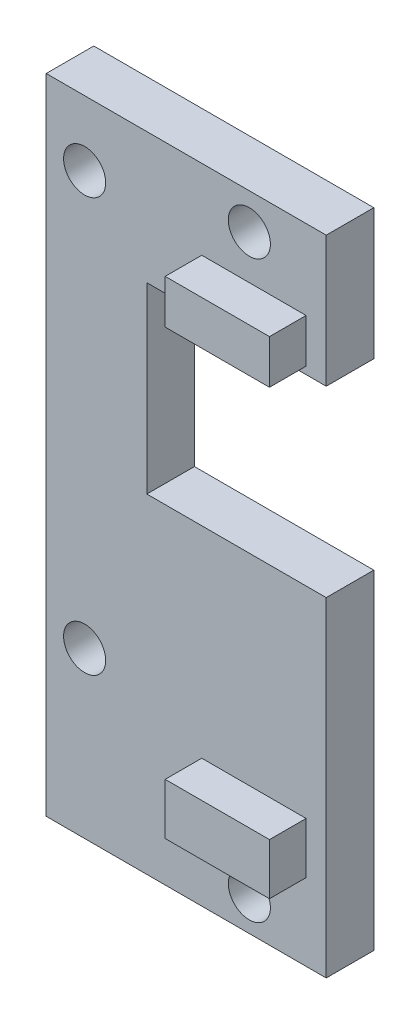
ISO-10303-21;
HEADER;
FILE_DESCRIPTION(('STEP AP214'),'2;1');
FILE_NAME('part.step','',(''),(''),'','','');
FILE_SCHEMA(('AUTOMOTIVE_DESIGN { 1 0 10303 214 1 1 1 1 }'));
ENDSEC;
DATA;
#1=APPLICATION_CONTEXT('core data for automotive mechanical design processes');
#2=APPLICATION_PROTOCOL_DEFINITION('international standard','automotive_design',2000,#1);
#3=PRODUCT_CONTEXT('',#1,'mechanical');
#4=PRODUCT('Part','Part','',(#3));
#5=PRODUCT_RELATED_PRODUCT_CATEGORY('part','',(#4));
#6=PRODUCT_DEFINITION_FORMATION('','',#4);
#7=PRODUCT_DEFINITION_CONTEXT('part definition',#1,'design');
#8=PRODUCT_DEFINITION('design','',#6,#7);
#9=PRODUCT_DEFINITION_SHAPE('','',#8);
#10=(LENGTH_UNIT() NAMED_UNIT(*) SI_UNIT(.MILLI.,.METRE.));
#11=(NAMED_UNIT(*) PLANE_ANGLE_UNIT() SI_UNIT($,.RADIAN.));
#12=(NAMED_UNIT(*) SI_UNIT($,.STERADIAN.) SOLID_ANGLE_UNIT());
#13=UNCERTAINTY_MEASURE_WITH_UNIT(LENGTH_MEASURE(1.E-05),#10,'distance_accuracy_value','');
#14=(GEOMETRIC_REPRESENTATION_CONTEXT(3) GLOBAL_UNCERTAINTY_ASSIGNED_CONTEXT((#13)) GLOBAL_UNIT_ASSIGNED_CONTEXT((#10,
#11,#12)) REPRESENTATION_CONTEXT('',''));
#15=CARTESIAN_POINT('',(0.,0.,0.));
#16=DIRECTION('',(0.,0.,1.));
#17=DIRECTION('',(1.,0.,0.));
#18=AXIS2_PLACEMENT_3D('',#15,#16,#17);
#19=CARTESIAN_POINT('',(0.,0.,2.6));
#20=DIRECTION('',(0.,0.,1.));
#21=DIRECTION('',(1.,0.,0.));
#22=AXIS2_PLACEMENT_3D('',#19,#20,#21);
#23=PLANE('',#22);
#24=CARTESIAN_POINT('',(-29.4,-30.2,2.6));
#25=DIRECTION('',(0.,0.,1.));
#26=DIRECTION('',(1.,0.,0.));
#27=AXIS2_PLACEMENT_3D('',#24,#25,#26);
#28=CIRCLE('',#27,1.15);
#29=CARTESIAN_POINT('',(-28.25,-30.2,2.6));
#30=VERTEX_POINT('',#29);
#31=EDGE_CURVE('E222',#30,#30,#28,.T.);
#32=ORIENTED_EDGE('',*,*,#31,.F.);
#33=EDGE_LOOP('',(#32));
#34=FACE_BOUND('',#33,.T.);
#35=CARTESIAN_POINT('',(-38.4,-23.,2.6));
#36=DIRECTION('',(0.,0.,1.));
#37=DIRECTION('',(1.,0.,0.));
#38=AXIS2_PLACEMENT_3D('',#35,#36,#37);
#39=CIRCLE('',#38,1.15);
#40=CARTESIAN_POINT('',(-37.25,-23.,2.6));
#41=VERTEX_POINT('',#40);
#42=EDGE_CURVE('E234',#41,#41,#39,.T.);
#43=ORIENTED_EDGE('',*,*,#42,.F.);
#44=EDGE_LOOP('',(#43));
#45=FACE_BOUND('',#44,.T.);
#46=DIRECTION('',(0.,-1.,0.));
#47=VECTOR('',#46,1.);
#48=CARTESIAN_POINT('',(-40.5,3.15,2.6));
#49=LINE('',#48,#47);
#50=CARTESIAN_POINT('',(-40.5,3.15,2.6));
#51=VERTEX_POINT('',#50);
#52=CARTESIAN_POINT('',(-40.5,-32.,2.6));
#53=VERTEX_POINT('',#52);
#54=EDGE_CURVE('E240',#51,#53,#49,.T.);
#55=ORIENTED_EDGE('',*,*,#54,.T.);
#56=DIRECTION('',(1.,0.,0.));
#57=VECTOR('',#56,1.);
#58=CARTESIAN_POINT('',(-40.5,-32.,2.6));
#59=LINE('',#58,#57);
#60=CARTESIAN_POINT('',(-25.2,-32.,2.6));
#61=VERTEX_POINT('',#60);
#62=EDGE_CURVE('E243',#53,#61,#59,.T.);
#63=ORIENTED_EDGE('',*,*,#62,.T.);
#64=DIRECTION('',(0.,1.,0.));
#65=VECTOR('',#64,1.);
#66=CARTESIAN_POINT('',(-25.2,-32.,2.6));
#67=LINE('',#66,#65);
#68=CARTESIAN_POINT('',(-25.2,-14.,2.6));
#69=VERTEX_POINT('',#68);
#70=EDGE_CURVE('E246',#61,#69,#67,.T.);
#71=ORIENTED_EDGE('',*,*,#70,.T.);
#72=DIRECTION('',(-1.,0.,0.));
#73=VECTOR('',#72,1.);
#74=CARTESIAN_POINT('',(-25.2,-14.,2.6));
#75=LINE('',#74,#73);
#76=CARTESIAN_POINT('',(-35.,-14.,2.6));
#77=VERTEX_POINT('',#76);
#78=EDGE_CURVE('E248',#69,#77,#75,.T.);
#79=ORIENTED_EDGE('',*,*,#78,.T.);
#80=DIRECTION('',(0.,1.,0.));
#81=VECTOR('',#80,1.);
#82=CARTESIAN_POINT('',(-35.,-14.,2.6));
#83=LINE('',#82,#81);
#84=CARTESIAN_POINT('',(-35.,-4.,2.6));
#85=VERTEX_POINT('',#84);
#86=EDGE_CURVE('E250',#77,#85,#83,.T.);
#87=ORIENTED_EDGE('',*,*,#86,.T.);
#88=DIRECTION('',(1.,0.,0.));
#89=VECTOR('',#88,1.);
#90=CARTESIAN_POINT('',(-35.,-4.,2.6));
#91=LINE('',#90,#89);
#92=CARTESIAN_POINT('',(-25.2,-4.,2.6));
#93=VERTEX_POINT('',#92);
#94=EDGE_CURVE('E252',#85,#93,#91,.T.);
#95=ORIENTED_EDGE('',*,*,#94,.T.);
#96=DIRECTION('',(0.,1.,0.));
#97=VECTOR('',#96,1.);
#98=CARTESIAN_POINT('',(-25.2,-4.,2.6));
#99=LINE('',#98,#97);
#100=CARTESIAN_POINT('',(-25.2,3.15,2.6));
#101=VERTEX_POINT('',#100);
#102=EDGE_CURVE('E254',#93,#101,#99,.T.);
#103=ORIENTED_EDGE('',*,*,#102,.T.);
#104=DIRECTION('',(-1.,0.,0.));
#105=VECTOR('',#104,1.);
#106=CARTESIAN_POINT('',(-25.2,3.15,2.6));
#107=LINE('',#106,#105);
#108=EDGE_CURVE('E256',#101,#51,#107,.T.);
#109=ORIENTED_EDGE('',*,*,#108,.T.);
#110=EDGE_LOOP('',(#55,#63,#71,#79,#87,#95,#103,#109));
#111=FACE_BOUND('',#110,.T.);
#112=CARTESIAN_POINT('',(-38.4,-0.4,2.6));
#113=DIRECTION('',(0.,0.,1.));
#114=DIRECTION('',(1.,0.,0.));
#115=AXIS2_PLACEMENT_3D('',#112,#113,#114);
#116=CIRCLE('',#115,1.15);
#117=CARTESIAN_POINT('',(-37.25,-0.4,2.6));
#118=VERTEX_POINT('',#117);
#119=EDGE_CURVE('E228',#118,#118,#116,.T.);
#120=ORIENTED_EDGE('',*,*,#119,.F.);
#121=EDGE_LOOP('',(#120));
#122=FACE_BOUND('',#121,.T.);
#123=CARTESIAN_POINT('',(-29.4,1.2,2.6));
#124=DIRECTION('',(0.,0.,1.));
#125=DIRECTION('',(1.,0.,0.));
#126=AXIS2_PLACEMENT_3D('',#123,#124,#125);
#127=CIRCLE('',#126,1.15);
#128=CARTESIAN_POINT('',(-28.25,1.2,2.6));
#129=VERTEX_POINT('',#128);
#130=EDGE_CURVE('E216',#129,#129,#127,.T.);
#131=ORIENTED_EDGE('',*,*,#130,.F.);
#132=EDGE_LOOP('',(#131));
#133=FACE_BOUND('',#132,.T.);
#134=DIRECTION('',(1.,0.,0.));
#135=VECTOR('',#134,1.);
#136=CARTESIAN_POINT('',(-32.,-27.8,2.6));
#137=LINE('',#136,#135);
#138=CARTESIAN_POINT('',(-32.,-27.8,2.6));
#139=VERTEX_POINT('',#138);
#140=CARTESIAN_POINT('',(-26.3,-27.8,2.6));
#141=VERTEX_POINT('',#140);
#142=EDGE_CURVE('E181',#139,#141,#137,.T.);
#143=ORIENTED_EDGE('',*,*,#142,.F.);
#144=DIRECTION('',(0.,-1.,0.));
#145=VECTOR('',#144,1.);
#146=CARTESIAN_POINT('',(-32.,-25.,2.6));
#147=LINE('',#146,#145);
#148=CARTESIAN_POINT('',(-32.,-25.,2.6));
#149=VERTEX_POINT('',#148);
#150=EDGE_CURVE('E178',#149,#139,#147,.T.);
#151=ORIENTED_EDGE('',*,*,#150,.F.);
#152=DIRECTION('',(-1.,0.,0.));
#153=VECTOR('',#152,1.);
#154=CARTESIAN_POINT('',(-26.3,-25.,2.6));
#155=LINE('',#154,#153);
#156=CARTESIAN_POINT('',(-26.3,-25.,2.6));
#157=VERTEX_POINT('',#156);
#158=EDGE_CURVE('E196',#157,#149,#155,.T.);
#159=ORIENTED_EDGE('',*,*,#158,.F.);
#160=DIRECTION('',(0.,1.,0.));
#161=VECTOR('',#160,1.);
#162=CARTESIAN_POINT('',(-26.3,-27.8,2.6));
#163=LINE('',#162,#161);
#164=EDGE_CURVE('E204',#141,#157,#163,.T.);
#165=ORIENTED_EDGE('',*,*,#164,.F.);
#166=EDGE_LOOP('',(#143,#151,#159,#165));
#167=FACE_BOUND('',#166,.T.);
#168=DIRECTION('',(1.,0.,0.));
#169=VECTOR('',#168,1.);
#170=CARTESIAN_POINT('',(-32.,-3.6,2.6));
#171=LINE('',#170,#169);
#172=CARTESIAN_POINT('',(-32.,-3.6,2.6));
#173=VERTEX_POINT('',#172);
#174=CARTESIAN_POINT('',(-26.3,-3.6,2.6));
#175=VERTEX_POINT('',#174);
#176=EDGE_CURVE('E177',#173,#175,#171,.T.);
#177=ORIENTED_EDGE('',*,*,#176,.F.);
#178=DIRECTION('',(0.,-1.,0.));
#179=VECTOR('',#178,1.);
#180=CARTESIAN_POINT('',(-32.,-1.2,2.6));
#181=LINE('',#180,#179);
#182=CARTESIAN_POINT('',(-32.,-1.2,2.6));
#183=VERTEX_POINT('',#182);
#184=EDGE_CURVE('E172',#183,#173,#181,.T.);
#185=ORIENTED_EDGE('',*,*,#184,.F.);
#186=DIRECTION('',(-1.,0.,0.));
#187=VECTOR('',#186,1.);
#188=CARTESIAN_POINT('',(-26.3,-1.2,2.6));
#189=LINE('',#188,#187);
#190=CARTESIAN_POINT('',(-26.3,-1.2,2.6));
#191=VERTEX_POINT('',#190);
#192=EDGE_CURVE('E157',#191,#183,#189,.T.);
#193=ORIENTED_EDGE('',*,*,#192,.F.);
#194=DIRECTION('',(0.,1.,0.));
#195=VECTOR('',#194,1.);
#196=CARTESIAN_POINT('',(-26.3,-3.6,2.6));
#197=LINE('',#196,#195);
#198=EDGE_CURVE('E165',#175,#191,#197,.T.);
#199=ORIENTED_EDGE('',*,*,#198,.F.);
#200=EDGE_LOOP('',(#177,#185,#193,#199));
#201=FACE_BOUND('',#200,.T.);
#202=ADVANCED_FACE('F43',(#34,#45,#111,#122,#133,#167,#201),#23,.T.);
#203=CARTESIAN_POINT('',(0.,0.,0.));
#204=DIRECTION('',(0.,0.,1.));
#205=DIRECTION('',(1.,0.,0.));
#206=AXIS2_PLACEMENT_3D('',#203,#204,#205);
#207=PLANE('',#206);
#208=DIRECTION('',(0.,-1.,0.));
#209=VECTOR('',#208,1.);
#210=CARTESIAN_POINT('',(-40.5,3.15,0.));
#211=LINE('',#210,#209);
#212=CARTESIAN_POINT('',(-40.5,3.15,0.));
#213=VERTEX_POINT('',#212);
#214=CARTESIAN_POINT('',(-40.5,-32.,0.));
#215=VERTEX_POINT('',#214);
#216=EDGE_CURVE('E237',#213,#215,#211,.T.);
#217=ORIENTED_EDGE('',*,*,#216,.F.);
#218=DIRECTION('',(-1.,0.,0.));
#219=VECTOR('',#218,1.);
#220=CARTESIAN_POINT('',(-25.2,3.15,0.));
#221=LINE('',#220,#219);
#222=CARTESIAN_POINT('',(-25.2,3.15,0.));
#223=VERTEX_POINT('',#222);
#224=EDGE_CURVE('E244',#223,#213,#221,.T.);
#225=ORIENTED_EDGE('',*,*,#224,.F.);
#226=DIRECTION('',(0.,1.,0.));
#227=VECTOR('',#226,1.);
#228=CARTESIAN_POINT('',(-25.2,-4.,0.));
#229=LINE('',#228,#227);
#230=CARTESIAN_POINT('',(-25.2,-4.,0.));
#231=VERTEX_POINT('',#230);
#232=EDGE_CURVE('E271',#231,#223,#229,.T.);
#233=ORIENTED_EDGE('',*,*,#232,.F.);
#234=DIRECTION('',(1.,0.,0.));
#235=VECTOR('',#234,1.);
#236=CARTESIAN_POINT('',(-35.,-4.,0.));
#237=LINE('',#236,#235);
#238=CARTESIAN_POINT('',(-35.,-4.,0.));
#239=VERTEX_POINT('',#238);
#240=EDGE_CURVE('E269',#239,#231,#237,.T.);
#241=ORIENTED_EDGE('',*,*,#240,.F.);
#242=DIRECTION('',(0.,1.,0.));
#243=VECTOR('',#242,1.);
#244=CARTESIAN_POINT('',(-35.,-14.,0.));
#245=LINE('',#244,#243);
#246=CARTESIAN_POINT('',(-35.,-14.,0.));
#247=VERTEX_POINT('',#246);
#248=EDGE_CURVE('E267',#247,#239,#245,.T.);
#249=ORIENTED_EDGE('',*,*,#248,.F.);
#250=DIRECTION('',(-1.,0.,0.));
#251=VECTOR('',#250,1.);
#252=CARTESIAN_POINT('',(-25.2,-14.,0.));
#253=LINE('',#252,#251);
#254=CARTESIAN_POINT('',(-25.2,-14.,0.));
#255=VERTEX_POINT('',#254);
#256=EDGE_CURVE('E265',#255,#247,#253,.T.);
#257=ORIENTED_EDGE('',*,*,#256,.F.);
#258=DIRECTION('',(0.,1.,0.));
#259=VECTOR('',#258,1.);
#260=CARTESIAN_POINT('',(-25.2,-32.,0.));
#261=LINE('',#260,#259);
#262=CARTESIAN_POINT('',(-25.2,-32.,0.));
#263=VERTEX_POINT('',#262);
#264=EDGE_CURVE('E263',#263,#255,#261,.T.);
#265=ORIENTED_EDGE('',*,*,#264,.F.);
#266=DIRECTION('',(1.,0.,0.));
#267=VECTOR('',#266,1.);
#268=CARTESIAN_POINT('',(-40.5,-32.,0.));
#269=LINE('',#268,#267);
#270=EDGE_CURVE('E261',#215,#263,#269,.T.);
#271=ORIENTED_EDGE('',*,*,#270,.F.);
#272=EDGE_LOOP('',(#217,#225,#233,#241,#249,#257,#265,#271));
#273=FACE_BOUND('',#272,.T.);
#274=CARTESIAN_POINT('',(-38.4,-23.,0.));
#275=DIRECTION('',(0.,0.,1.));
#276=DIRECTION('',(1.,0.,0.));
#277=AXIS2_PLACEMENT_3D('',#274,#275,#276);
#278=CIRCLE('',#277,1.15);
#279=CARTESIAN_POINT('',(-37.25,-23.,0.));
#280=VERTEX_POINT('',#279);
#281=EDGE_CURVE('E231',#280,#280,#278,.T.);
#282=ORIENTED_EDGE('',*,*,#281,.T.);
#283=EDGE_LOOP('',(#282));
#284=FACE_BOUND('',#283,.T.);
#285=CARTESIAN_POINT('',(-38.4,-0.4,0.));
#286=DIRECTION('',(0.,0.,1.));
#287=DIRECTION('',(1.,0.,0.));
#288=AXIS2_PLACEMENT_3D('',#285,#286,#287);
#289=CIRCLE('',#288,1.15);
#290=CARTESIAN_POINT('',(-37.25,-0.4,0.));
#291=VERTEX_POINT('',#290);
#292=EDGE_CURVE('E225',#291,#291,#289,.T.);
#293=ORIENTED_EDGE('',*,*,#292,.T.);
#294=EDGE_LOOP('',(#293));
#295=FACE_BOUND('',#294,.T.);
#296=CARTESIAN_POINT('',(-29.4,-30.2,0.));
#297=DIRECTION('',(0.,0.,1.));
#298=DIRECTION('',(1.,0.,0.));
#299=AXIS2_PLACEMENT_3D('',#296,#297,#298);
#300=CIRCLE('',#299,1.15);
#301=CARTESIAN_POINT('',(-28.25,-30.2,0.));
#302=VERTEX_POINT('',#301);
#303=EDGE_CURVE('E219',#302,#302,#300,.T.);
#304=ORIENTED_EDGE('',*,*,#303,.T.);
#305=EDGE_LOOP('',(#304));
#306=FACE_BOUND('',#305,.T.);
#307=CARTESIAN_POINT('',(-29.4,1.2,0.));
#308=DIRECTION('',(0.,0.,1.));
#309=DIRECTION('',(1.,0.,0.));
#310=AXIS2_PLACEMENT_3D('',#307,#308,#309);
#311=CIRCLE('',#310,1.15);
#312=CARTESIAN_POINT('',(-28.25,1.2,0.));
#313=VERTEX_POINT('',#312);
#314=EDGE_CURVE('E215',#313,#313,#311,.T.);
#315=ORIENTED_EDGE('',*,*,#314,.T.);
#316=EDGE_LOOP('',(#315));
#317=FACE_BOUND('',#316,.T.);
#318=ADVANCED_FACE('F301',(#273,#284,#295,#306,#317),#207,.F.);
#319=CARTESIAN_POINT('',(-40.5,3.15,2.6));
#320=DIRECTION('',(1.,0.,0.));
#321=DIRECTION('',(0.,0.,-1.));
#322=AXIS2_PLACEMENT_3D('',#319,#320,#321);
#323=PLANE('',#322);
#324=ORIENTED_EDGE('',*,*,#216,.T.);
#325=DIRECTION('',(0.,0.,-1.));
#326=VECTOR('',#325,1.);
#327=CARTESIAN_POINT('',(-40.5,-32.,2.6));
#328=LINE('',#327,#326);
#329=EDGE_CURVE('E11',#53,#215,#328,.T.);
#330=ORIENTED_EDGE('',*,*,#329,.F.);
#331=ORIENTED_EDGE('',*,*,#54,.F.);
#332=DIRECTION('',(0.,0.,-1.));
#333=VECTOR('',#332,1.);
#334=CARTESIAN_POINT('',(-40.5,3.15,2.6));
#335=LINE('',#334,#333);
#336=EDGE_CURVE('E258',#51,#213,#335,.T.);
#337=ORIENTED_EDGE('',*,*,#336,.T.);
#338=EDGE_LOOP('',(#324,#330,#331,#337));
#339=FACE_BOUND('',#338,.T.);
#340=ADVANCED_FACE('F45',(#339),#323,.F.);
#341=CARTESIAN_POINT('',(-40.5,-32.,2.6));
#342=DIRECTION('',(0.,1.,0.));
#343=DIRECTION('',(0.,0.,1.));
#344=AXIS2_PLACEMENT_3D('',#341,#342,#343);
#345=PLANE('',#344);
#346=ORIENTED_EDGE('',*,*,#270,.T.);
#347=DIRECTION('',(0.,0.,-1.));
#348=VECTOR('',#347,1.);
#349=CARTESIAN_POINT('',(-25.2,-32.,2.6));
#350=LINE('',#349,#348);
#351=EDGE_CURVE('E51',#61,#263,#350,.T.);
#352=ORIENTED_EDGE('',*,*,#351,.F.);
#353=ORIENTED_EDGE('',*,*,#62,.F.);
#354=ORIENTED_EDGE('',*,*,#329,.T.);
#355=EDGE_LOOP('',(#346,#352,#353,#354));
#356=FACE_BOUND('',#355,.T.);
#357=ADVANCED_FACE('F319',(#356),#345,.F.);
#358=CARTESIAN_POINT('',(-25.2,-32.,2.6));
#359=DIRECTION('',(-1.,0.,0.));
#360=DIRECTION('',(0.,0.,1.));
#361=AXIS2_PLACEMENT_3D('',#358,#359,#360);
#362=PLANE('',#361);
#363=ORIENTED_EDGE('',*,*,#264,.T.);
#364=DIRECTION('',(0.,0.,-1.));
#365=VECTOR('',#364,1.);
#366=CARTESIAN_POINT('',(-25.2,-14.,2.6));
#367=LINE('',#366,#365);
#368=EDGE_CURVE('E288',#69,#255,#367,.T.);
#369=ORIENTED_EDGE('',*,*,#368,.F.);
#370=ORIENTED_EDGE('',*,*,#70,.F.);
#371=ORIENTED_EDGE('',*,*,#351,.T.);
#372=EDGE_LOOP('',(#363,#369,#370,#371));
#373=FACE_BOUND('',#372,.T.);
#374=ADVANCED_FACE('F295',(#373),#362,.F.);
#375=CARTESIAN_POINT('',(-25.2,-14.,2.6));
#376=DIRECTION('',(0.,-1.,0.));
#377=DIRECTION('',(0.,0.,-1.));
#378=AXIS2_PLACEMENT_3D('',#375,#376,#377);
#379=PLANE('',#378);
#380=ORIENTED_EDGE('',*,*,#256,.T.);
#381=DIRECTION('',(0.,0.,-1.));
#382=VECTOR('',#381,1.);
#383=CARTESIAN_POINT('',(-35.,-14.,2.6));
#384=LINE('',#383,#382);
#385=EDGE_CURVE('E285',#77,#247,#384,.T.);
#386=ORIENTED_EDGE('',*,*,#385,.F.);
#387=ORIENTED_EDGE('',*,*,#78,.F.);
#388=ORIENTED_EDGE('',*,*,#368,.T.);
#389=EDGE_LOOP('',(#380,#386,#387,#388));
#390=FACE_BOUND('',#389,.T.);
#391=ADVANCED_FACE('F307',(#390),#379,.F.);
#392=CARTESIAN_POINT('',(-35.,-14.,2.6));
#393=DIRECTION('',(-1.,0.,0.));
#394=DIRECTION('',(0.,0.,1.));
#395=AXIS2_PLACEMENT_3D('',#392,#393,#394);
#396=PLANE('',#395);
#397=ORIENTED_EDGE('',*,*,#248,.T.);
#398=DIRECTION('',(0.,0.,-1.));
#399=VECTOR('',#398,1.);
#400=CARTESIAN_POINT('',(-35.,-4.,2.6));
#401=LINE('',#400,#399);
#402=EDGE_CURVE('E282',#85,#239,#401,.T.);
#403=ORIENTED_EDGE('',*,*,#402,.F.);
#404=ORIENTED_EDGE('',*,*,#86,.F.);
#405=ORIENTED_EDGE('',*,*,#385,.T.);
#406=EDGE_LOOP('',(#397,#403,#404,#405));
#407=FACE_BOUND('',#406,.T.);
#408=ADVANCED_FACE('F311',(#407),#396,.F.);
#409=CARTESIAN_POINT('',(-35.,-4.,2.6));
#410=DIRECTION('',(0.,1.,0.));
#411=DIRECTION('',(0.,0.,1.));
#412=AXIS2_PLACEMENT_3D('',#409,#410,#411);
#413=PLANE('',#412);
#414=ORIENTED_EDGE('',*,*,#240,.T.);
#415=DIRECTION('',(0.,0.,-1.));
#416=VECTOR('',#415,1.);
#417=CARTESIAN_POINT('',(-25.2,-4.,2.6));
#418=LINE('',#417,#416);
#419=EDGE_CURVE('E279',#93,#231,#418,.T.);
#420=ORIENTED_EDGE('',*,*,#419,.F.);
#421=ORIENTED_EDGE('',*,*,#94,.F.);
#422=ORIENTED_EDGE('',*,*,#402,.T.);
#423=EDGE_LOOP('',(#414,#420,#421,#422));
#424=FACE_BOUND('',#423,.T.);
#425=ADVANCED_FACE('F332',(#424),#413,.F.);
#426=CARTESIAN_POINT('',(-25.2,-4.,2.6));
#427=DIRECTION('',(-1.,0.,0.));
#428=DIRECTION('',(0.,0.,1.));
#429=AXIS2_PLACEMENT_3D('',#426,#427,#428);
#430=PLANE('',#429);
#431=ORIENTED_EDGE('',*,*,#232,.T.);
#432=DIRECTION('',(0.,0.,-1.));
#433=VECTOR('',#432,1.);
#434=CARTESIAN_POINT('',(-25.2,3.15,2.6));
#435=LINE('',#434,#433);
#436=EDGE_CURVE('E276',#101,#223,#435,.T.);
#437=ORIENTED_EDGE('',*,*,#436,.F.);
#438=ORIENTED_EDGE('',*,*,#102,.F.);
#439=ORIENTED_EDGE('',*,*,#419,.T.);
#440=EDGE_LOOP('',(#431,#437,#438,#439));
#441=FACE_BOUND('',#440,.T.);
#442=ADVANCED_FACE('F330',(#441),#430,.F.);
#443=CARTESIAN_POINT('',(-25.2,3.15,2.6));
#444=DIRECTION('',(0.,-1.,0.));
#445=DIRECTION('',(0.,0.,-1.));
#446=AXIS2_PLACEMENT_3D('',#443,#444,#445);
#447=PLANE('',#446);
#448=ORIENTED_EDGE('',*,*,#224,.T.);
#449=ORIENTED_EDGE('',*,*,#336,.F.);
#450=ORIENTED_EDGE('',*,*,#108,.F.);
#451=ORIENTED_EDGE('',*,*,#436,.T.);
#452=EDGE_LOOP('',(#448,#449,#450,#451));
#453=FACE_BOUND('',#452,.T.);
#454=ADVANCED_FACE('F325',(#453),#447,.F.);
#455=CARTESIAN_POINT('',(-38.4,-23.,2.6));
#456=DIRECTION('',(0.,0.,-1.));
#457=DIRECTION('',(-1.,0.,0.));
#458=AXIS2_PLACEMENT_3D('',#455,#456,#457);
#459=CYLINDRICAL_SURFACE('',#458,1.15);
#460=ORIENTED_EDGE('',*,*,#42,.T.);
#461=EDGE_LOOP('',(#460));
#462=FACE_BOUND('',#461,.T.);
#463=ORIENTED_EDGE('',*,*,#281,.F.);
#464=EDGE_LOOP('',(#463));
#465=FACE_BOUND('',#464,.T.);
#466=ADVANCED_FACE('F353',(#462,#465),#459,.F.);
#467=CARTESIAN_POINT('',(-38.4,-0.4,2.6));
#468=DIRECTION('',(0.,0.,-1.));
#469=DIRECTION('',(-1.,0.,0.));
#470=AXIS2_PLACEMENT_3D('',#467,#468,#469);
#471=CYLINDRICAL_SURFACE('',#470,1.15);
#472=ORIENTED_EDGE('',*,*,#119,.T.);
#473=EDGE_LOOP('',(#472));
#474=FACE_BOUND('',#473,.T.);
#475=ORIENTED_EDGE('',*,*,#292,.F.);
#476=EDGE_LOOP('',(#475));
#477=FACE_BOUND('',#476,.T.);
#478=ADVANCED_FACE('F360',(#474,#477),#471,.F.);
#479=CARTESIAN_POINT('',(-29.4,-30.2,2.6));
#480=DIRECTION('',(0.,0.,-1.));
#481=DIRECTION('',(-1.,0.,0.));
#482=AXIS2_PLACEMENT_3D('',#479,#480,#481);
#483=CYLINDRICAL_SURFACE('',#482,1.15);
#484=ORIENTED_EDGE('',*,*,#31,.T.);
#485=EDGE_LOOP('',(#484));
#486=FACE_BOUND('',#485,.T.);
#487=ORIENTED_EDGE('',*,*,#303,.F.);
#488=EDGE_LOOP('',(#487));
#489=FACE_BOUND('',#488,.T.);
#490=ADVANCED_FACE('F365',(#486,#489),#483,.F.);
#491=CARTESIAN_POINT('',(-29.4,1.2,2.6));
#492=DIRECTION('',(0.,0.,-1.));
#493=DIRECTION('',(-1.,0.,0.));
#494=AXIS2_PLACEMENT_3D('',#491,#492,#493);
#495=CYLINDRICAL_SURFACE('',#494,1.15);
#496=ORIENTED_EDGE('',*,*,#130,.T.);
#497=EDGE_LOOP('',(#496));
#498=FACE_BOUND('',#497,.T.);
#499=ORIENTED_EDGE('',*,*,#314,.F.);
#500=EDGE_LOOP('',(#499));
#501=FACE_BOUND('',#500,.T.);
#502=ADVANCED_FACE('F377',(#498,#501),#495,.F.);
#503=CARTESIAN_POINT('',(-32.,-25.,4.6));
#504=DIRECTION('',(1.,0.,0.));
#505=DIRECTION('',(0.,0.,-1.));
#506=AXIS2_PLACEMENT_3D('',#503,#504,#505);
#507=PLANE('',#506);
#508=ORIENTED_EDGE('',*,*,#150,.T.);
#509=DIRECTION('',(0.,0.,-1.));
#510=VECTOR('',#509,1.);
#511=CARTESIAN_POINT('',(-32.,-27.8,4.6));
#512=LINE('',#511,#510);
#513=CARTESIAN_POINT('',(-32.,-27.8,4.6));
#514=VERTEX_POINT('',#513);
#515=EDGE_CURVE('E213',#514,#139,#512,.T.);
#516=ORIENTED_EDGE('',*,*,#515,.F.);
#517=DIRECTION('',(0.,-1.,0.));
#518=VECTOR('',#517,1.);
#519=CARTESIAN_POINT('',(-32.,-25.,4.6));
#520=LINE('',#519,#518);
#521=CARTESIAN_POINT('',(-32.,-25.,4.6));
#522=VERTEX_POINT('',#521);
#523=EDGE_CURVE('E192',#522,#514,#520,.T.);
#524=ORIENTED_EDGE('',*,*,#523,.F.);
#525=DIRECTION('',(0.,0.,-1.));
#526=VECTOR('',#525,1.);
#527=CARTESIAN_POINT('',(-32.,-25.,4.6));
#528=LINE('',#527,#526);
#529=EDGE_CURVE('E201',#522,#149,#528,.T.);
#530=ORIENTED_EDGE('',*,*,#529,.T.);
#531=EDGE_LOOP('',(#508,#516,#524,#530));
#532=FACE_BOUND('',#531,.T.);
#533=ADVANCED_FACE('F378',(#532),#507,.F.);
#534=CARTESIAN_POINT('',(-32.,-27.8,4.6));
#535=DIRECTION('',(0.,1.,0.));
#536=DIRECTION('',(0.,0.,1.));
#537=AXIS2_PLACEMENT_3D('',#534,#535,#536);
#538=PLANE('',#537);
#539=ORIENTED_EDGE('',*,*,#142,.T.);
#540=DIRECTION('',(0.,0.,-1.));
#541=VECTOR('',#540,1.);
#542=CARTESIAN_POINT('',(-26.3,-27.8,4.6));
#543=LINE('',#542,#541);
#544=CARTESIAN_POINT('',(-26.3,-27.8,4.6));
#545=VERTEX_POINT('',#544);
#546=EDGE_CURVE('E210',#545,#141,#543,.T.);
#547=ORIENTED_EDGE('',*,*,#546,.F.);
#548=DIRECTION('',(1.,0.,0.));
#549=VECTOR('',#548,1.);
#550=CARTESIAN_POINT('',(-32.,-27.8,4.6));
#551=LINE('',#550,#549);
#552=EDGE_CURVE('E195',#514,#545,#551,.T.);
#553=ORIENTED_EDGE('',*,*,#552,.F.);
#554=ORIENTED_EDGE('',*,*,#515,.T.);
#555=EDGE_LOOP('',(#539,#547,#553,#554));
#556=FACE_BOUND('',#555,.T.);
#557=ADVANCED_FACE('F384',(#556),#538,.F.);
#558=CARTESIAN_POINT('',(-26.3,-27.8,4.6));
#559=DIRECTION('',(-1.,0.,0.));
#560=DIRECTION('',(0.,0.,1.));
#561=AXIS2_PLACEMENT_3D('',#558,#559,#560);
#562=PLANE('',#561);
#563=ORIENTED_EDGE('',*,*,#164,.T.);
#564=DIRECTION('',(0.,0.,-1.));
#565=VECTOR('',#564,1.);
#566=CARTESIAN_POINT('',(-26.3,-25.,4.6));
#567=LINE('',#566,#565);
#568=CARTESIAN_POINT('',(-26.3,-25.,4.6));
#569=VERTEX_POINT('',#568);
#570=EDGE_CURVE('E66',#569,#157,#567,.T.);
#571=ORIENTED_EDGE('',*,*,#570,.F.);
#572=DIRECTION('',(0.,1.,0.));
#573=VECTOR('',#572,1.);
#574=CARTESIAN_POINT('',(-26.3,-27.8,4.6));
#575=LINE('',#574,#573);
#576=EDGE_CURVE('E198',#545,#569,#575,.T.);
#577=ORIENTED_EDGE('',*,*,#576,.F.);
#578=ORIENTED_EDGE('',*,*,#546,.T.);
#579=EDGE_LOOP('',(#563,#571,#577,#578));
#580=FACE_BOUND('',#579,.T.);
#581=ADVANCED_FACE('F392',(#580),#562,.F.);
#582=CARTESIAN_POINT('',(-26.3,-25.,4.6));
#583=DIRECTION('',(0.,-1.,0.));
#584=DIRECTION('',(0.,0.,-1.));
#585=AXIS2_PLACEMENT_3D('',#582,#583,#584);
#586=PLANE('',#585);
#587=ORIENTED_EDGE('',*,*,#158,.T.);
#588=ORIENTED_EDGE('',*,*,#529,.F.);
#589=DIRECTION('',(-1.,0.,0.));
#590=VECTOR('',#589,1.);
#591=CARTESIAN_POINT('',(-26.3,-25.,4.6));
#592=LINE('',#591,#590);
#593=EDGE_CURVE('E200',#569,#522,#592,.T.);
#594=ORIENTED_EDGE('',*,*,#593,.F.);
#595=ORIENTED_EDGE('',*,*,#570,.T.);
#596=EDGE_LOOP('',(#587,#588,#594,#595));
#597=FACE_BOUND('',#596,.T.);
#598=ADVANCED_FACE('F396',(#597),#586,.F.);
#599=CARTESIAN_POINT('',(0.,0.,4.6));
#600=DIRECTION('',(0.,0.,1.));
#601=DIRECTION('',(1.,0.,0.));
#602=AXIS2_PLACEMENT_3D('',#599,#600,#601);
#603=PLANE('',#602);
#604=ORIENTED_EDGE('',*,*,#523,.T.);
#605=ORIENTED_EDGE('',*,*,#552,.T.);
#606=ORIENTED_EDGE('',*,*,#576,.T.);
#607=ORIENTED_EDGE('',*,*,#593,.T.);
#608=EDGE_LOOP('',(#604,#605,#606,#607));
#609=FACE_BOUND('',#608,.T.);
#610=ADVANCED_FACE('F400',(#609),#603,.T.);
#611=CARTESIAN_POINT('',(-32.,-1.2,4.6));
#612=DIRECTION('',(1.,0.,0.));
#613=DIRECTION('',(0.,0.,-1.));
#614=AXIS2_PLACEMENT_3D('',#611,#612,#613);
#615=PLANE('',#614);
#616=ORIENTED_EDGE('',*,*,#184,.T.);
#617=DIRECTION('',(0.,0.,-1.));
#618=VECTOR('',#617,1.);
#619=CARTESIAN_POINT('',(-32.,-3.6,4.6));
#620=LINE('',#619,#618);
#621=CARTESIAN_POINT('',(-32.,-3.6,4.6));
#622=VERTEX_POINT('',#621);
#623=EDGE_CURVE('E563',#622,#173,#620,.T.);
#624=ORIENTED_EDGE('',*,*,#623,.F.);
#625=DIRECTION('',(0.,-1.,0.));
#626=VECTOR('',#625,1.);
#627=CARTESIAN_POINT('',(-32.,-1.2,4.6));
#628=LINE('',#627,#626);
#629=CARTESIAN_POINT('',(-32.,-1.2,4.6));
#630=VERTEX_POINT('',#629);
#631=EDGE_CURVE('E166',#630,#622,#628,.T.);
#632=ORIENTED_EDGE('',*,*,#631,.F.);
#633=DIRECTION('',(0.,0.,-1.));
#634=VECTOR('',#633,1.);
#635=CARTESIAN_POINT('',(-32.,-1.2,4.6));
#636=LINE('',#635,#634);
#637=EDGE_CURVE('E160',#630,#183,#636,.T.);
#638=ORIENTED_EDGE('',*,*,#637,.T.);
#639=EDGE_LOOP('',(#616,#624,#632,#638));
#640=FACE_BOUND('',#639,.T.);
#641=ADVANCED_FACE('F170',(#640),#615,.F.);
#642=CARTESIAN_POINT('',(-32.,-3.6,4.6));
#643=DIRECTION('',(0.,1.,0.));
#644=DIRECTION('',(0.,0.,1.));
#645=AXIS2_PLACEMENT_3D('',#642,#643,#644);
#646=PLANE('',#645);
#647=ORIENTED_EDGE('',*,*,#176,.T.);
#648=DIRECTION('',(0.,0.,-1.));
#649=VECTOR('',#648,1.);
#650=CARTESIAN_POINT('',(-26.3,-3.6,4.6));
#651=LINE('',#650,#649);
#652=CARTESIAN_POINT('',(-26.3,-3.6,4.6));
#653=VERTEX_POINT('',#652);
#654=EDGE_CURVE('E561',#653,#175,#651,.T.);
#655=ORIENTED_EDGE('',*,*,#654,.F.);
#656=DIRECTION('',(1.,0.,0.));
#657=VECTOR('',#656,1.);
#658=CARTESIAN_POINT('',(-32.,-3.6,4.6));
#659=LINE('',#658,#657);
#660=EDGE_CURVE('E189',#622,#653,#659,.T.);
#661=ORIENTED_EDGE('',*,*,#660,.F.);
#662=ORIENTED_EDGE('',*,*,#623,.T.);
#663=EDGE_LOOP('',(#647,#655,#661,#662));
#664=FACE_BOUND('',#663,.T.);
#665=ADVANCED_FACE('F413',(#664),#646,.F.);
#666=CARTESIAN_POINT('',(-26.3,-3.6,4.6));
#667=DIRECTION('',(-1.,0.,0.));
#668=DIRECTION('',(0.,0.,1.));
#669=AXIS2_PLACEMENT_3D('',#666,#667,#668);
#670=PLANE('',#669);
#671=ORIENTED_EDGE('',*,*,#198,.T.);
#672=DIRECTION('',(0.,0.,-1.));
#673=VECTOR('',#672,1.);
#674=CARTESIAN_POINT('',(-26.3,-1.2,4.6));
#675=LINE('',#674,#673);
#676=CARTESIAN_POINT('',(-26.3,-1.2,4.6));
#677=VERTEX_POINT('',#676);
#678=EDGE_CURVE('E58',#677,#191,#675,.T.);
#679=ORIENTED_EDGE('',*,*,#678,.F.);
#680=DIRECTION('',(0.,1.,0.));
#681=VECTOR('',#680,1.);
#682=CARTESIAN_POINT('',(-26.3,-3.6,4.6));
#683=LINE('',#682,#681);
#684=EDGE_CURVE('E187',#653,#677,#683,.T.);
#685=ORIENTED_EDGE('',*,*,#684,.F.);
#686=ORIENTED_EDGE('',*,*,#654,.T.);
#687=EDGE_LOOP('',(#671,#679,#685,#686));
#688=FACE_BOUND('',#687,.T.);
#689=ADVANCED_FACE('F410',(#688),#670,.F.);
#690=CARTESIAN_POINT('',(-26.3,-1.2,4.6));
#691=DIRECTION('',(0.,-1.,0.));
#692=DIRECTION('',(0.,0.,-1.));
#693=AXIS2_PLACEMENT_3D('',#690,#691,#692);
#694=PLANE('',#693);
#695=ORIENTED_EDGE('',*,*,#192,.T.);
#696=ORIENTED_EDGE('',*,*,#637,.F.);
#697=DIRECTION('',(-1.,0.,0.));
#698=VECTOR('',#697,1.);
#699=CARTESIAN_POINT('',(-26.3,-1.2,4.6));
#700=LINE('',#699,#698);
#701=EDGE_CURVE('E175',#677,#630,#700,.T.);
#702=ORIENTED_EDGE('',*,*,#701,.F.);
#703=ORIENTED_EDGE('',*,*,#678,.T.);
#704=EDGE_LOOP('',(#695,#696,#702,#703));
#705=FACE_BOUND('',#704,.T.);
#706=ADVANCED_FACE('F159',(#705),#694,.F.);
#707=CARTESIAN_POINT('',(0.,0.,4.6));
#708=DIRECTION('',(0.,0.,1.));
#709=DIRECTION('',(1.,0.,0.));
#710=AXIS2_PLACEMENT_3D('',#707,#708,#709);
#711=PLANE('',#710);
#712=ORIENTED_EDGE('',*,*,#631,.T.);
#713=ORIENTED_EDGE('',*,*,#660,.T.);
#714=ORIENTED_EDGE('',*,*,#684,.T.);
#715=ORIENTED_EDGE('',*,*,#701,.T.);
#716=EDGE_LOOP('',(#712,#713,#714,#715));
#717=FACE_BOUND('',#716,.T.);
#718=ADVANCED_FACE('F404',(#717),#711,.T.);
#719=CLOSED_SHELL('',(#202,#318,#340,#357,#374,#391,#408,#425,#442,#454,#466,#478,#490,#502,
#533,#557,#581,#598,#610,#641,#665,#689,#706,#718));
#720=MANIFOLD_SOLID_BREP('B2',#719);
#721=ADVANCED_BREP_SHAPE_REPRESENTATION('',(#18,#720),#14);
#722=SHAPE_DEFINITION_REPRESENTATION(#9,#721);
ENDSEC;
END-ISO-10303-21;
